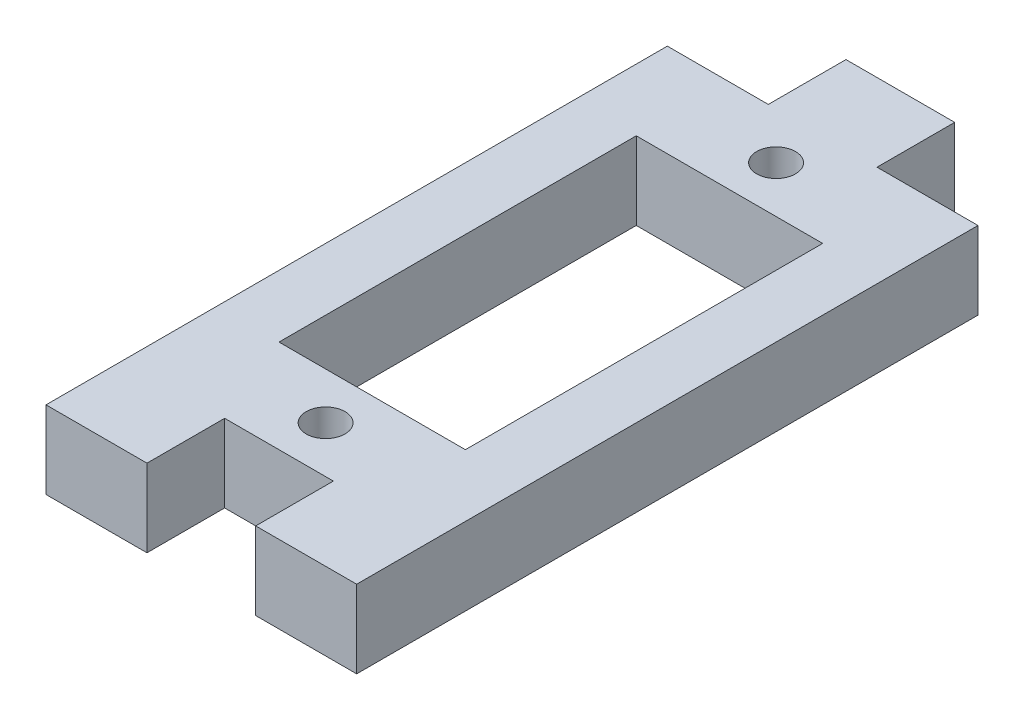
ISO-10303-21;
HEADER;
FILE_DESCRIPTION(('STEP AP214'),'2;1');
FILE_NAME('part.step','',(''),(''),'','','');
FILE_SCHEMA(('AUTOMOTIVE_DESIGN { 1 0 10303 214 1 1 1 1 }'));
ENDSEC;
DATA;
#1=APPLICATION_CONTEXT('core data for automotive mechanical design processes');
#2=APPLICATION_PROTOCOL_DEFINITION('international standard','automotive_design',2000,#1);
#3=PRODUCT_CONTEXT('',#1,'mechanical');
#4=PRODUCT('Part','Part','',(#3));
#5=PRODUCT_RELATED_PRODUCT_CATEGORY('part','',(#4));
#6=PRODUCT_DEFINITION_FORMATION('','',#4);
#7=PRODUCT_DEFINITION_CONTEXT('part definition',#1,'design');
#8=PRODUCT_DEFINITION('design','',#6,#7);
#9=PRODUCT_DEFINITION_SHAPE('','',#8);
#10=(LENGTH_UNIT() NAMED_UNIT(*) SI_UNIT(.MILLI.,.METRE.));
#11=(NAMED_UNIT(*) PLANE_ANGLE_UNIT() SI_UNIT($,.RADIAN.));
#12=(NAMED_UNIT(*) SI_UNIT($,.STERADIAN.) SOLID_ANGLE_UNIT());
#13=UNCERTAINTY_MEASURE_WITH_UNIT(LENGTH_MEASURE(1.E-05),#10,'distance_accuracy_value','');
#14=(GEOMETRIC_REPRESENTATION_CONTEXT(3) GLOBAL_UNCERTAINTY_ASSIGNED_CONTEXT((#13)) GLOBAL_UNIT_ASSIGNED_CONTEXT((#10,
#11,#12)) REPRESENTATION_CONTEXT('',''));
#15=CARTESIAN_POINT('',(0.,0.,0.));
#16=DIRECTION('',(0.,0.,1.));
#17=DIRECTION('',(1.,0.,0.));
#18=AXIS2_PLACEMENT_3D('',#15,#16,#17);
#19=CARTESIAN_POINT('',(-3.5,5.,-20.));
#20=DIRECTION('',(0.,0.,1.));
#21=DIRECTION('',(1.,0.,0.));
#22=AXIS2_PLACEMENT_3D('',#19,#20,#21);
#23=PLANE('',#22);
#24=DIRECTION('',(-1.,0.,0.));
#25=VECTOR('',#24,1.);
#26=CARTESIAN_POINT('',(-3.5,0.,-20.));
#27=LINE('',#26,#25);
#28=CARTESIAN_POINT('',(-3.5,0.,-20.));
#29=VERTEX_POINT('',#28);
#30=CARTESIAN_POINT('',(-10.,0.,-20.));
#31=VERTEX_POINT('',#30);
#32=EDGE_CURVE('E190',#29,#31,#27,.T.);
#33=ORIENTED_EDGE('',*,*,#32,.T.);
#34=DIRECTION('',(0.,-1.,0.));
#35=VECTOR('',#34,1.);
#36=CARTESIAN_POINT('',(-10.,5.,-20.));
#37=LINE('',#36,#35);
#38=CARTESIAN_POINT('',(-10.,5.,-20.));
#39=VERTEX_POINT('',#38);
#40=EDGE_CURVE('E11',#39,#31,#37,.T.);
#41=ORIENTED_EDGE('',*,*,#40,.F.);
#42=DIRECTION('',(-1.,0.,0.));
#43=VECTOR('',#42,1.);
#44=CARTESIAN_POINT('',(-3.5,5.,-20.));
#45=LINE('',#44,#43);
#46=CARTESIAN_POINT('',(-3.5,5.,-20.));
#47=VERTEX_POINT('',#46);
#48=EDGE_CURVE('E194',#47,#39,#45,.T.);
#49=ORIENTED_EDGE('',*,*,#48,.F.);
#50=DIRECTION('',(0.,-1.,0.));
#51=VECTOR('',#50,1.);
#52=CARTESIAN_POINT('',(-3.5,5.,-20.));
#53=LINE('',#52,#51);
#54=EDGE_CURVE('E220',#47,#29,#53,.T.);
#55=ORIENTED_EDGE('',*,*,#54,.T.);
#56=EDGE_LOOP('',(#33,#41,#49,#55));
#57=FACE_BOUND('',#56,.T.);
#58=ADVANCED_FACE('F41',(#57),#23,.F.);
#59=CARTESIAN_POINT('',(-10.,5.,-20.));
#60=DIRECTION('',(1.,0.,0.));
#61=DIRECTION('',(0.,0.,-1.));
#62=AXIS2_PLACEMENT_3D('',#59,#60,#61);
#63=PLANE('',#62);
#64=DIRECTION('',(0.,0.,1.));
#65=VECTOR('',#64,1.);
#66=CARTESIAN_POINT('',(-10.,0.,-20.));
#67=LINE('',#66,#65);
#68=CARTESIAN_POINT('',(-10.,0.,20.));
#69=VERTEX_POINT('',#68);
#70=EDGE_CURVE('E223',#31,#69,#67,.T.);
#71=ORIENTED_EDGE('',*,*,#70,.T.);
#72=DIRECTION('',(0.,-1.,0.));
#73=VECTOR('',#72,1.);
#74=CARTESIAN_POINT('',(-10.,5.,20.));
#75=LINE('',#74,#73);
#76=CARTESIAN_POINT('',(-10.,5.,20.));
#77=VERTEX_POINT('',#76);
#78=EDGE_CURVE('E48',#77,#69,#75,.T.);
#79=ORIENTED_EDGE('',*,*,#78,.F.);
#80=DIRECTION('',(0.,0.,1.));
#81=VECTOR('',#80,1.);
#82=CARTESIAN_POINT('',(-10.,5.,-20.));
#83=LINE('',#82,#81);
#84=EDGE_CURVE('E197',#39,#77,#83,.T.);
#85=ORIENTED_EDGE('',*,*,#84,.F.);
#86=ORIENTED_EDGE('',*,*,#40,.T.);
#87=EDGE_LOOP('',(#71,#79,#85,#86));
#88=FACE_BOUND('',#87,.T.);
#89=ADVANCED_FACE('F298',(#88),#63,.F.);
#90=CARTESIAN_POINT('',(-10.,5.,20.));
#91=DIRECTION('',(0.,0.,-1.));
#92=DIRECTION('',(-1.,0.,0.));
#93=AXIS2_PLACEMENT_3D('',#90,#91,#92);
#94=PLANE('',#93);
#95=DIRECTION('',(1.,0.,0.));
#96=VECTOR('',#95,1.);
#97=CARTESIAN_POINT('',(-10.,0.,20.));
#98=LINE('',#97,#96);
#99=CARTESIAN_POINT('',(-3.5,0.,20.));
#100=VERTEX_POINT('',#99);
#101=EDGE_CURVE('E225',#69,#100,#98,.T.);
#102=ORIENTED_EDGE('',*,*,#101,.T.);
#103=DIRECTION('',(0.,-1.,0.));
#104=VECTOR('',#103,1.);
#105=CARTESIAN_POINT('',(-3.5,5.,20.));
#106=LINE('',#105,#104);
#107=CARTESIAN_POINT('',(-3.5,5.,20.));
#108=VERTEX_POINT('',#107);
#109=EDGE_CURVE('E270',#108,#100,#106,.T.);
#110=ORIENTED_EDGE('',*,*,#109,.F.);
#111=DIRECTION('',(1.,0.,0.));
#112=VECTOR('',#111,1.);
#113=CARTESIAN_POINT('',(-10.,5.,20.));
#114=LINE('',#113,#112);
#115=EDGE_CURVE('E200',#77,#108,#114,.T.);
#116=ORIENTED_EDGE('',*,*,#115,.F.);
#117=ORIENTED_EDGE('',*,*,#78,.T.);
#118=EDGE_LOOP('',(#102,#110,#116,#117));
#119=FACE_BOUND('',#118,.T.);
#120=ADVANCED_FACE('F277',(#119),#94,.F.);
#121=CARTESIAN_POINT('',(-3.5,5.,20.));
#122=DIRECTION('',(-1.,0.,0.));
#123=DIRECTION('',(0.,0.,1.));
#124=AXIS2_PLACEMENT_3D('',#121,#122,#123);
#125=PLANE('',#124);
#126=DIRECTION('',(0.,0.,-1.));
#127=VECTOR('',#126,1.);
#128=CARTESIAN_POINT('',(-3.5,0.,20.));
#129=LINE('',#128,#127);
#130=CARTESIAN_POINT('',(-3.5,0.,15.));
#131=VERTEX_POINT('',#130);
#132=EDGE_CURVE('E227',#100,#131,#129,.T.);
#133=ORIENTED_EDGE('',*,*,#132,.T.);
#134=DIRECTION('',(0.,-1.,0.));
#135=VECTOR('',#134,1.);
#136=CARTESIAN_POINT('',(-3.5,5.,15.));
#137=LINE('',#136,#135);
#138=CARTESIAN_POINT('',(-3.5,5.,15.));
#139=VERTEX_POINT('',#138);
#140=EDGE_CURVE('E267',#139,#131,#137,.T.);
#141=ORIENTED_EDGE('',*,*,#140,.F.);
#142=DIRECTION('',(0.,0.,-1.));
#143=VECTOR('',#142,1.);
#144=CARTESIAN_POINT('',(-3.5,5.,20.));
#145=LINE('',#144,#143);
#146=EDGE_CURVE('E202',#108,#139,#145,.T.);
#147=ORIENTED_EDGE('',*,*,#146,.F.);
#148=ORIENTED_EDGE('',*,*,#109,.T.);
#149=EDGE_LOOP('',(#133,#141,#147,#148));
#150=FACE_BOUND('',#149,.T.);
#151=ADVANCED_FACE('F286',(#150),#125,.F.);
#152=CARTESIAN_POINT('',(-3.5,5.,15.));
#153=DIRECTION('',(0.,0.,-1.));
#154=DIRECTION('',(-1.,0.,0.));
#155=AXIS2_PLACEMENT_3D('',#152,#153,#154);
#156=PLANE('',#155);
#157=DIRECTION('',(1.,0.,0.));
#158=VECTOR('',#157,1.);
#159=CARTESIAN_POINT('',(-3.5,0.,15.));
#160=LINE('',#159,#158);
#161=CARTESIAN_POINT('',(3.5,0.,15.));
#162=VERTEX_POINT('',#161);
#163=EDGE_CURVE('E229',#131,#162,#160,.T.);
#164=ORIENTED_EDGE('',*,*,#163,.T.);
#165=DIRECTION('',(0.,-1.,0.));
#166=VECTOR('',#165,1.);
#167=CARTESIAN_POINT('',(3.5,5.,15.));
#168=LINE('',#167,#166);
#169=CARTESIAN_POINT('',(3.5,5.,15.));
#170=VERTEX_POINT('',#169);
#171=EDGE_CURVE('E264',#170,#162,#168,.T.);
#172=ORIENTED_EDGE('',*,*,#171,.F.);
#173=DIRECTION('',(1.,0.,0.));
#174=VECTOR('',#173,1.);
#175=CARTESIAN_POINT('',(-3.5,5.,15.));
#176=LINE('',#175,#174);
#177=EDGE_CURVE('E204',#139,#170,#176,.T.);
#178=ORIENTED_EDGE('',*,*,#177,.F.);
#179=ORIENTED_EDGE('',*,*,#140,.T.);
#180=EDGE_LOOP('',(#164,#172,#178,#179));
#181=FACE_BOUND('',#180,.T.);
#182=ADVANCED_FACE('F290',(#181),#156,.F.);
#183=CARTESIAN_POINT('',(3.5,5.,15.));
#184=DIRECTION('',(1.,0.,0.));
#185=DIRECTION('',(0.,0.,-1.));
#186=AXIS2_PLACEMENT_3D('',#183,#184,#185);
#187=PLANE('',#186);
#188=DIRECTION('',(0.,0.,1.));
#189=VECTOR('',#188,1.);
#190=CARTESIAN_POINT('',(3.5,0.,15.));
#191=LINE('',#190,#189);
#192=CARTESIAN_POINT('',(3.5,0.,20.));
#193=VERTEX_POINT('',#192);
#194=EDGE_CURVE('E231',#162,#193,#191,.T.);
#195=ORIENTED_EDGE('',*,*,#194,.T.);
#196=DIRECTION('',(0.,-1.,0.));
#197=VECTOR('',#196,1.);
#198=CARTESIAN_POINT('',(3.5,5.,20.));
#199=LINE('',#198,#197);
#200=CARTESIAN_POINT('',(3.5,5.,20.));
#201=VERTEX_POINT('',#200);
#202=EDGE_CURVE('E261',#201,#193,#199,.T.);
#203=ORIENTED_EDGE('',*,*,#202,.F.);
#204=DIRECTION('',(0.,0.,1.));
#205=VECTOR('',#204,1.);
#206=CARTESIAN_POINT('',(3.5,5.,15.));
#207=LINE('',#206,#205);
#208=EDGE_CURVE('E206',#170,#201,#207,.T.);
#209=ORIENTED_EDGE('',*,*,#208,.F.);
#210=ORIENTED_EDGE('',*,*,#171,.T.);
#211=EDGE_LOOP('',(#195,#203,#209,#210));
#212=FACE_BOUND('',#211,.T.);
#213=ADVANCED_FACE('F331',(#212),#187,.F.);
#214=CARTESIAN_POINT('',(3.5,5.,20.));
#215=DIRECTION('',(0.,0.,-1.));
#216=DIRECTION('',(-1.,0.,0.));
#217=AXIS2_PLACEMENT_3D('',#214,#215,#216);
#218=PLANE('',#217);
#219=DIRECTION('',(1.,0.,0.));
#220=VECTOR('',#219,1.);
#221=CARTESIAN_POINT('',(3.5,0.,20.));
#222=LINE('',#221,#220);
#223=CARTESIAN_POINT('',(10.,0.,20.));
#224=VERTEX_POINT('',#223);
#225=EDGE_CURVE('E233',#193,#224,#222,.T.);
#226=ORIENTED_EDGE('',*,*,#225,.T.);
#227=DIRECTION('',(0.,-1.,0.));
#228=VECTOR('',#227,1.);
#229=CARTESIAN_POINT('',(10.,5.,20.));
#230=LINE('',#229,#228);
#231=CARTESIAN_POINT('',(10.,5.,20.));
#232=VERTEX_POINT('',#231);
#233=EDGE_CURVE('E258',#232,#224,#230,.T.);
#234=ORIENTED_EDGE('',*,*,#233,.F.);
#235=DIRECTION('',(1.,0.,0.));
#236=VECTOR('',#235,1.);
#237=CARTESIAN_POINT('',(3.5,5.,20.));
#238=LINE('',#237,#236);
#239=EDGE_CURVE('E208',#201,#232,#238,.T.);
#240=ORIENTED_EDGE('',*,*,#239,.F.);
#241=ORIENTED_EDGE('',*,*,#202,.T.);
#242=EDGE_LOOP('',(#226,#234,#240,#241));
#243=FACE_BOUND('',#242,.T.);
#244=ADVANCED_FACE('F329',(#243),#218,.F.);
#245=CARTESIAN_POINT('',(10.,5.,20.));
#246=DIRECTION('',(-1.,0.,0.));
#247=DIRECTION('',(0.,0.,1.));
#248=AXIS2_PLACEMENT_3D('',#245,#246,#247);
#249=PLANE('',#248);
#250=DIRECTION('',(0.,0.,-1.));
#251=VECTOR('',#250,1.);
#252=CARTESIAN_POINT('',(10.,0.,20.));
#253=LINE('',#252,#251);
#254=CARTESIAN_POINT('',(10.,0.,-20.));
#255=VERTEX_POINT('',#254);
#256=EDGE_CURVE('E235',#224,#255,#253,.T.);
#257=ORIENTED_EDGE('',*,*,#256,.T.);
#258=DIRECTION('',(0.,-1.,0.));
#259=VECTOR('',#258,1.);
#260=CARTESIAN_POINT('',(10.,5.,-20.));
#261=LINE('',#260,#259);
#262=CARTESIAN_POINT('',(10.,5.,-20.));
#263=VERTEX_POINT('',#262);
#264=EDGE_CURVE('E255',#263,#255,#261,.T.);
#265=ORIENTED_EDGE('',*,*,#264,.F.);
#266=DIRECTION('',(0.,0.,-1.));
#267=VECTOR('',#266,1.);
#268=CARTESIAN_POINT('',(10.,5.,20.));
#269=LINE('',#268,#267);
#270=EDGE_CURVE('E210',#232,#263,#269,.T.);
#271=ORIENTED_EDGE('',*,*,#270,.F.);
#272=ORIENTED_EDGE('',*,*,#233,.T.);
#273=EDGE_LOOP('',(#257,#265,#271,#272));
#274=FACE_BOUND('',#273,.T.);
#275=ADVANCED_FACE('F325',(#274),#249,.F.);
#276=CARTESIAN_POINT('',(10.,5.,-20.));
#277=DIRECTION('',(0.,0.,1.));
#278=DIRECTION('',(1.,0.,0.));
#279=AXIS2_PLACEMENT_3D('',#276,#277,#278);
#280=PLANE('',#279);
#281=DIRECTION('',(-1.,0.,0.));
#282=VECTOR('',#281,1.);
#283=CARTESIAN_POINT('',(10.,0.,-20.));
#284=LINE('',#283,#282);
#285=CARTESIAN_POINT('',(3.5,0.,-20.));
#286=VERTEX_POINT('',#285);
#287=EDGE_CURVE('E237',#255,#286,#284,.T.);
#288=ORIENTED_EDGE('',*,*,#287,.T.);
#289=DIRECTION('',(0.,-1.,0.));
#290=VECTOR('',#289,1.);
#291=CARTESIAN_POINT('',(3.5,5.,-20.));
#292=LINE('',#291,#290);
#293=CARTESIAN_POINT('',(3.5,5.,-20.));
#294=VERTEX_POINT('',#293);
#295=EDGE_CURVE('E252',#294,#286,#292,.T.);
#296=ORIENTED_EDGE('',*,*,#295,.F.);
#297=DIRECTION('',(-1.,0.,0.));
#298=VECTOR('',#297,1.);
#299=CARTESIAN_POINT('',(10.,5.,-20.));
#300=LINE('',#299,#298);
#301=EDGE_CURVE('E212',#263,#294,#300,.T.);
#302=ORIENTED_EDGE('',*,*,#301,.F.);
#303=ORIENTED_EDGE('',*,*,#264,.T.);
#304=EDGE_LOOP('',(#288,#296,#302,#303));
#305=FACE_BOUND('',#304,.T.);
#306=ADVANCED_FACE('F320',(#305),#280,.F.);
#307=CARTESIAN_POINT('',(3.5,5.,-25.));
#308=DIRECTION('',(-1.,0.,0.));
#309=DIRECTION('',(0.,0.,1.));
#310=AXIS2_PLACEMENT_3D('',#307,#308,#309);
#311=PLANE('',#310);
#312=DIRECTION('',(0.,0.,-1.));
#313=VECTOR('',#312,1.);
#314=CARTESIAN_POINT('',(3.5,0.,-25.));
#315=LINE('',#314,#313);
#316=CARTESIAN_POINT('',(3.5,0.,-25.));
#317=VERTEX_POINT('',#316);
#318=EDGE_CURVE('E239',#286,#317,#315,.T.);
#319=ORIENTED_EDGE('',*,*,#318,.T.);
#320=DIRECTION('',(0.,-1.,0.));
#321=VECTOR('',#320,1.);
#322=CARTESIAN_POINT('',(3.5,5.,-25.));
#323=LINE('',#322,#321);
#324=CARTESIAN_POINT('',(3.5,5.,-25.));
#325=VERTEX_POINT('',#324);
#326=EDGE_CURVE('E249',#325,#317,#323,.T.);
#327=ORIENTED_EDGE('',*,*,#326,.F.);
#328=DIRECTION('',(0.,0.,-1.));
#329=VECTOR('',#328,1.);
#330=CARTESIAN_POINT('',(3.5,5.,-25.));
#331=LINE('',#330,#329);
#332=EDGE_CURVE('E214',#294,#325,#331,.T.);
#333=ORIENTED_EDGE('',*,*,#332,.F.);
#334=ORIENTED_EDGE('',*,*,#295,.T.);
#335=EDGE_LOOP('',(#319,#327,#333,#334));
#336=FACE_BOUND('',#335,.T.);
#337=ADVANCED_FACE('F314',(#336),#311,.F.);
#338=CARTESIAN_POINT('',(-3.5,5.,-25.));
#339=DIRECTION('',(0.,0.,1.));
#340=DIRECTION('',(1.,0.,0.));
#341=AXIS2_PLACEMENT_3D('',#338,#339,#340);
#342=PLANE('',#341);
#343=DIRECTION('',(-1.,0.,0.));
#344=VECTOR('',#343,1.);
#345=CARTESIAN_POINT('',(-3.5,0.,-25.));
#346=LINE('',#345,#344);
#347=CARTESIAN_POINT('',(-3.5,0.,-25.));
#348=VERTEX_POINT('',#347);
#349=EDGE_CURVE('E241',#317,#348,#346,.T.);
#350=ORIENTED_EDGE('',*,*,#349,.T.);
#351=DIRECTION('',(0.,-1.,0.));
#352=VECTOR('',#351,1.);
#353=CARTESIAN_POINT('',(-3.5,5.,-25.));
#354=LINE('',#353,#352);
#355=CARTESIAN_POINT('',(-3.5,5.,-25.));
#356=VERTEX_POINT('',#355);
#357=EDGE_CURVE('E246',#356,#348,#354,.T.);
#358=ORIENTED_EDGE('',*,*,#357,.F.);
#359=DIRECTION('',(-1.,0.,0.));
#360=VECTOR('',#359,1.);
#361=CARTESIAN_POINT('',(-3.5,5.,-25.));
#362=LINE('',#361,#360);
#363=EDGE_CURVE('E216',#325,#356,#362,.T.);
#364=ORIENTED_EDGE('',*,*,#363,.F.);
#365=ORIENTED_EDGE('',*,*,#326,.T.);
#366=EDGE_LOOP('',(#350,#358,#364,#365));
#367=FACE_BOUND('',#366,.T.);
#368=ADVANCED_FACE('F310',(#367),#342,.F.);
#369=CARTESIAN_POINT('',(-3.5,5.,-20.));
#370=DIRECTION('',(1.,0.,0.));
#371=DIRECTION('',(0.,0.,-1.));
#372=AXIS2_PLACEMENT_3D('',#369,#370,#371);
#373=PLANE('',#372);
#374=DIRECTION('',(0.,0.,1.));
#375=VECTOR('',#374,1.);
#376=CARTESIAN_POINT('',(-3.5,0.,-20.));
#377=LINE('',#376,#375);
#378=EDGE_CURVE('E198',#348,#29,#377,.T.);
#379=ORIENTED_EDGE('',*,*,#378,.T.);
#380=ORIENTED_EDGE('',*,*,#54,.F.);
#381=DIRECTION('',(0.,0.,1.));
#382=VECTOR('',#381,1.);
#383=CARTESIAN_POINT('',(-3.5,5.,-20.));
#384=LINE('',#383,#382);
#385=EDGE_CURVE('E218',#356,#47,#384,.T.);
#386=ORIENTED_EDGE('',*,*,#385,.F.);
#387=ORIENTED_EDGE('',*,*,#357,.T.);
#388=EDGE_LOOP('',(#379,#380,#386,#387));
#389=FACE_BOUND('',#388,.T.);
#390=ADVANCED_FACE('F305',(#389),#373,.F.);
#391=CARTESIAN_POINT('',(0.,5.,0.));
#392=DIRECTION('',(0.,1.,0.));
#393=DIRECTION('',(0.,0.,1.));
#394=AXIS2_PLACEMENT_3D('',#391,#392,#393);
#395=PLANE('',#394);
#396=CARTESIAN_POINT('',(0.,5.,12.));
#397=DIRECTION('',(0.,1.,0.));
#398=DIRECTION('',(0.,0.,1.));
#399=AXIS2_PLACEMENT_3D('',#396,#397,#398);
#400=CIRCLE('',#399,1.25);
#401=CARTESIAN_POINT('',(0.,5.,13.25));
#402=VERTEX_POINT('',#401);
#403=EDGE_CURVE('E177',#402,#402,#400,.T.);
#404=ORIENTED_EDGE('',*,*,#403,.F.);
#405=EDGE_LOOP('',(#404));
#406=FACE_BOUND('',#405,.T.);
#407=CARTESIAN_POINT('',(0.,5.,-17.));
#408=DIRECTION('',(0.,1.,0.));
#409=DIRECTION('',(0.,0.,1.));
#410=AXIS2_PLACEMENT_3D('',#407,#408,#409);
#411=CIRCLE('',#410,1.25);
#412=CARTESIAN_POINT('',(0.,5.,-15.75));
#413=VERTEX_POINT('',#412);
#414=EDGE_CURVE('E491',#413,#413,#411,.T.);
#415=ORIENTED_EDGE('',*,*,#414,.F.);
#416=EDGE_LOOP('',(#415));
#417=FACE_BOUND('',#416,.T.);
#418=DIRECTION('',(0.,0.,-1.));
#419=VECTOR('',#418,1.);
#420=CARTESIAN_POINT('',(6.,5.,-14.));
#421=LINE('',#420,#419);
#422=CARTESIAN_POINT('',(6.,5.,9.));
#423=VERTEX_POINT('',#422);
#424=CARTESIAN_POINT('',(6.,5.,-14.));
#425=VERTEX_POINT('',#424);
#426=EDGE_CURVE('E55',#423,#425,#421,.T.);
#427=ORIENTED_EDGE('',*,*,#426,.F.);
#428=DIRECTION('',(1.,0.,0.));
#429=VECTOR('',#428,1.);
#430=CARTESIAN_POINT('',(-6.,5.,9.));
#431=LINE('',#430,#429);
#432=CARTESIAN_POINT('',(-6.,5.,9.));
#433=VERTEX_POINT('',#432);
#434=EDGE_CURVE('E171',#433,#423,#431,.T.);
#435=ORIENTED_EDGE('',*,*,#434,.F.);
#436=DIRECTION('',(0.,0.,1.));
#437=VECTOR('',#436,1.);
#438=CARTESIAN_POINT('',(-6.,5.,-14.));
#439=LINE('',#438,#437);
#440=CARTESIAN_POINT('',(-6.,5.,-14.));
#441=VERTEX_POINT('',#440);
#442=EDGE_CURVE('E174',#441,#433,#439,.T.);
#443=ORIENTED_EDGE('',*,*,#442,.F.);
#444=DIRECTION('',(-1.,0.,0.));
#445=VECTOR('',#444,1.);
#446=CARTESIAN_POINT('',(-6.,5.,-14.));
#447=LINE('',#446,#445);
#448=EDGE_CURVE('E183',#425,#441,#447,.T.);
#449=ORIENTED_EDGE('',*,*,#448,.F.);
#450=EDGE_LOOP('',(#427,#435,#443,#449));
#451=FACE_BOUND('',#450,.T.);
#452=ORIENTED_EDGE('',*,*,#48,.T.);
#453=ORIENTED_EDGE('',*,*,#84,.T.);
#454=ORIENTED_EDGE('',*,*,#115,.T.);
#455=ORIENTED_EDGE('',*,*,#146,.T.);
#456=ORIENTED_EDGE('',*,*,#177,.T.);
#457=ORIENTED_EDGE('',*,*,#208,.T.);
#458=ORIENTED_EDGE('',*,*,#239,.T.);
#459=ORIENTED_EDGE('',*,*,#270,.T.);
#460=ORIENTED_EDGE('',*,*,#301,.T.);
#461=ORIENTED_EDGE('',*,*,#332,.T.);
#462=ORIENTED_EDGE('',*,*,#363,.T.);
#463=ORIENTED_EDGE('',*,*,#385,.T.);
#464=EDGE_LOOP('',(#452,#453,#454,#455,#456,#457,#458,#459,#460,#461,#462,#463));
#465=FACE_BOUND('',#464,.T.);
#466=ADVANCED_FACE('F294',(#406,#417,#451,#465),#395,.T.);
#467=CARTESIAN_POINT('',(0.,0.,0.));
#468=DIRECTION('',(0.,1.,0.));
#469=DIRECTION('',(0.,0.,1.));
#470=AXIS2_PLACEMENT_3D('',#467,#468,#469);
#471=PLANE('',#470);
#472=CARTESIAN_POINT('',(0.,0.,12.));
#473=DIRECTION('',(0.,1.,0.));
#474=DIRECTION('',(0.,0.,1.));
#475=AXIS2_PLACEMENT_3D('',#472,#473,#474);
#476=CIRCLE('',#475,1.25);
#477=CARTESIAN_POINT('',(0.,0.,13.25));
#478=VERTEX_POINT('',#477);
#479=EDGE_CURVE('E488',#478,#478,#476,.T.);
#480=ORIENTED_EDGE('',*,*,#479,.T.);
#481=EDGE_LOOP('',(#480));
#482=FACE_BOUND('',#481,.T.);
#483=CARTESIAN_POINT('',(0.,0.,-17.));
#484=DIRECTION('',(0.,1.,0.));
#485=DIRECTION('',(0.,0.,1.));
#486=AXIS2_PLACEMENT_3D('',#483,#484,#485);
#487=CIRCLE('',#486,1.25);
#488=CARTESIAN_POINT('',(0.,0.,-15.75));
#489=VERTEX_POINT('',#488);
#490=EDGE_CURVE('E184',#489,#489,#487,.T.);
#491=ORIENTED_EDGE('',*,*,#490,.T.);
#492=EDGE_LOOP('',(#491));
#493=FACE_BOUND('',#492,.T.);
#494=DIRECTION('',(1.,0.,0.));
#495=VECTOR('',#494,1.);
#496=CARTESIAN_POINT('',(-6.,0.,9.));
#497=LINE('',#496,#495);
#498=CARTESIAN_POINT('',(-6.,0.,9.));
#499=VERTEX_POINT('',#498);
#500=CARTESIAN_POINT('',(6.,0.,9.));
#501=VERTEX_POINT('',#500);
#502=EDGE_CURVE('E161',#499,#501,#497,.T.);
#503=ORIENTED_EDGE('',*,*,#502,.T.);
#504=DIRECTION('',(0.,0.,-1.));
#505=VECTOR('',#504,1.);
#506=CARTESIAN_POINT('',(6.,0.,-14.));
#507=LINE('',#506,#505);
#508=CARTESIAN_POINT('',(6.,0.,-14.));
#509=VERTEX_POINT('',#508);
#510=EDGE_CURVE('E155',#501,#509,#507,.T.);
#511=ORIENTED_EDGE('',*,*,#510,.T.);
#512=DIRECTION('',(-1.,0.,0.));
#513=VECTOR('',#512,1.);
#514=CARTESIAN_POINT('',(-6.,0.,-14.));
#515=LINE('',#514,#513);
#516=CARTESIAN_POINT('',(-6.,0.,-14.));
#517=VERTEX_POINT('',#516);
#518=EDGE_CURVE('E164',#509,#517,#515,.T.);
#519=ORIENTED_EDGE('',*,*,#518,.T.);
#520=DIRECTION('',(0.,0.,1.));
#521=VECTOR('',#520,1.);
#522=CARTESIAN_POINT('',(-6.,0.,-14.));
#523=LINE('',#522,#521);
#524=EDGE_CURVE('E63',#517,#499,#523,.T.);
#525=ORIENTED_EDGE('',*,*,#524,.T.);
#526=EDGE_LOOP('',(#503,#511,#519,#525));
#527=FACE_BOUND('',#526,.T.);
#528=ORIENTED_EDGE('',*,*,#32,.F.);
#529=ORIENTED_EDGE('',*,*,#378,.F.);
#530=ORIENTED_EDGE('',*,*,#349,.F.);
#531=ORIENTED_EDGE('',*,*,#318,.F.);
#532=ORIENTED_EDGE('',*,*,#287,.F.);
#533=ORIENTED_EDGE('',*,*,#256,.F.);
#534=ORIENTED_EDGE('',*,*,#225,.F.);
#535=ORIENTED_EDGE('',*,*,#194,.F.);
#536=ORIENTED_EDGE('',*,*,#163,.F.);
#537=ORIENTED_EDGE('',*,*,#132,.F.);
#538=ORIENTED_EDGE('',*,*,#101,.F.);
#539=ORIENTED_EDGE('',*,*,#70,.F.);
#540=EDGE_LOOP('',(#528,#529,#530,#531,#532,#533,#534,#535,#536,#537,#538,#539));
#541=FACE_BOUND('',#540,.T.);
#542=ADVANCED_FACE('F168',(#482,#493,#527,#541),#471,.F.);
#543=CARTESIAN_POINT('',(6.,0.,-14.));
#544=DIRECTION('',(1.,0.,0.));
#545=DIRECTION('',(0.,0.,-1.));
#546=AXIS2_PLACEMENT_3D('',#543,#544,#545);
#547=PLANE('',#546);
#548=ORIENTED_EDGE('',*,*,#426,.T.);
#549=DIRECTION('',(0.,1.,0.));
#550=VECTOR('',#549,1.);
#551=CARTESIAN_POINT('',(6.,0.,-14.));
#552=LINE('',#551,#550);
#553=EDGE_CURVE('E151',#509,#425,#552,.T.);
#554=ORIENTED_EDGE('',*,*,#553,.F.);
#555=ORIENTED_EDGE('',*,*,#510,.F.);
#556=DIRECTION('',(0.,1.,0.));
#557=VECTOR('',#556,1.);
#558=CARTESIAN_POINT('',(6.,0.,9.));
#559=LINE('',#558,#557);
#560=EDGE_CURVE('E188',#501,#423,#559,.T.);
#561=ORIENTED_EDGE('',*,*,#560,.T.);
#562=EDGE_LOOP('',(#548,#554,#555,#561));
#563=FACE_BOUND('',#562,.T.);
#564=ADVANCED_FACE('F153',(#563),#547,.F.);
#565=CARTESIAN_POINT('',(-6.,0.,9.));
#566=DIRECTION('',(0.,0.,1.));
#567=DIRECTION('',(1.,0.,0.));
#568=AXIS2_PLACEMENT_3D('',#565,#566,#567);
#569=PLANE('',#568);
#570=ORIENTED_EDGE('',*,*,#434,.T.);
#571=ORIENTED_EDGE('',*,*,#560,.F.);
#572=ORIENTED_EDGE('',*,*,#502,.F.);
#573=DIRECTION('',(0.,1.,0.));
#574=VECTOR('',#573,1.);
#575=CARTESIAN_POINT('',(-6.,0.,9.));
#576=LINE('',#575,#574);
#577=EDGE_CURVE('E191',#499,#433,#576,.T.);
#578=ORIENTED_EDGE('',*,*,#577,.T.);
#579=EDGE_LOOP('',(#570,#571,#572,#578));
#580=FACE_BOUND('',#579,.T.);
#581=ADVANCED_FACE('F435',(#580),#569,.F.);
#582=CARTESIAN_POINT('',(-6.,0.,-14.));
#583=DIRECTION('',(-1.,0.,0.));
#584=DIRECTION('',(0.,0.,1.));
#585=AXIS2_PLACEMENT_3D('',#582,#583,#584);
#586=PLANE('',#585);
#587=ORIENTED_EDGE('',*,*,#442,.T.);
#588=ORIENTED_EDGE('',*,*,#577,.F.);
#589=ORIENTED_EDGE('',*,*,#524,.F.);
#590=DIRECTION('',(0.,1.,0.));
#591=VECTOR('',#590,1.);
#592=CARTESIAN_POINT('',(-6.,0.,-14.));
#593=LINE('',#592,#591);
#594=EDGE_CURVE('E160',#517,#441,#593,.T.);
#595=ORIENTED_EDGE('',*,*,#594,.T.);
#596=EDGE_LOOP('',(#587,#588,#589,#595));
#597=FACE_BOUND('',#596,.T.);
#598=ADVANCED_FACE('F444',(#597),#586,.F.);
#599=CARTESIAN_POINT('',(-6.,0.,-14.));
#600=DIRECTION('',(0.,0.,-1.));
#601=DIRECTION('',(-1.,0.,0.));
#602=AXIS2_PLACEMENT_3D('',#599,#600,#601);
#603=PLANE('',#602);
#604=ORIENTED_EDGE('',*,*,#448,.T.);
#605=ORIENTED_EDGE('',*,*,#594,.F.);
#606=ORIENTED_EDGE('',*,*,#518,.F.);
#607=ORIENTED_EDGE('',*,*,#553,.T.);
#608=EDGE_LOOP('',(#604,#605,#606,#607));
#609=FACE_BOUND('',#608,.T.);
#610=ADVANCED_FACE('F165',(#609),#603,.F.);
#611=CARTESIAN_POINT('',(0.,0.,-17.));
#612=DIRECTION('',(0.,1.,0.));
#613=DIRECTION('',(0.,0.,1.));
#614=AXIS2_PLACEMENT_3D('',#611,#612,#613);
#615=CYLINDRICAL_SURFACE('',#614,1.25);
#616=ORIENTED_EDGE('',*,*,#490,.F.);
#617=EDGE_LOOP('',(#616));
#618=FACE_BOUND('',#617,.T.);
#619=ORIENTED_EDGE('',*,*,#414,.T.);
#620=EDGE_LOOP('',(#619));
#621=FACE_BOUND('',#620,.T.);
#622=ADVANCED_FACE('F462',(#618,#621),#615,.F.);
#623=CARTESIAN_POINT('',(0.,0.,12.));
#624=DIRECTION('',(0.,1.,0.));
#625=DIRECTION('',(0.,0.,1.));
#626=AXIS2_PLACEMENT_3D('',#623,#624,#625);
#627=CYLINDRICAL_SURFACE('',#626,1.25);
#628=ORIENTED_EDGE('',*,*,#479,.F.);
#629=EDGE_LOOP('',(#628));
#630=FACE_BOUND('',#629,.T.);
#631=ORIENTED_EDGE('',*,*,#403,.T.);
#632=EDGE_LOOP('',(#631));
#633=FACE_BOUND('',#632,.T.);
#634=ADVANCED_FACE('F471',(#630,#633),#627,.F.);
#635=CLOSED_SHELL('',(#58,#89,#120,#151,#182,#213,#244,#275,#306,#337,#368,#390,#466,#542,#564,
#581,#598,#610,#622,#634));
#636=MANIFOLD_SOLID_BREP('B2',#635);
#637=ADVANCED_BREP_SHAPE_REPRESENTATION('',(#18,#636),#14);
#638=SHAPE_DEFINITION_REPRESENTATION(#9,#637);
ENDSEC;
END-ISO-10303-21;
